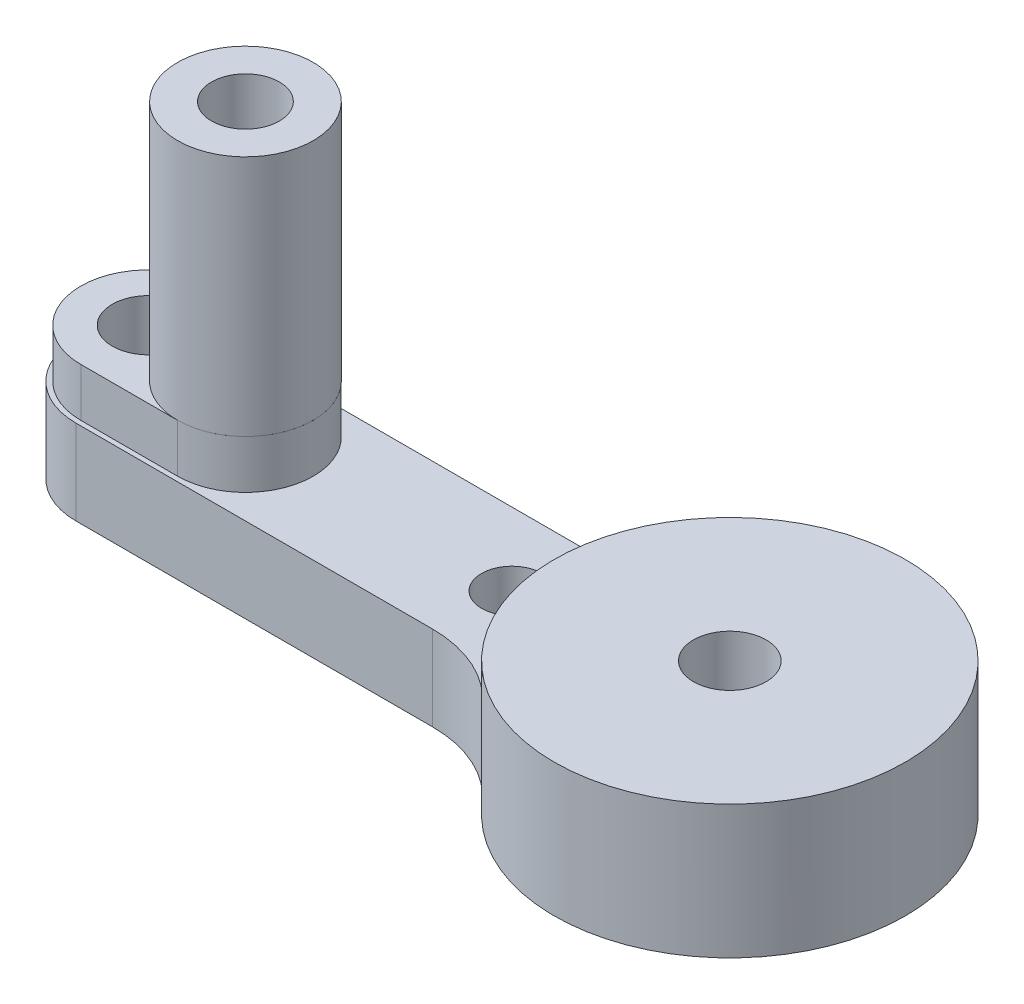
ISO-10303-21;
HEADER;
FILE_DESCRIPTION(('STEP AP214'),'2;1');
FILE_NAME('part.step','',(''),(''),'','','');
FILE_SCHEMA(('AUTOMOTIVE_DESIGN { 1 0 10303 214 1 1 1 1 }'));
ENDSEC;
DATA;
#1=APPLICATION_CONTEXT('core data for automotive mechanical design processes');
#2=APPLICATION_PROTOCOL_DEFINITION('international standard','automotive_design',2000,#1);
#3=PRODUCT_CONTEXT('',#1,'mechanical');
#4=PRODUCT('Part','Part','',(#3));
#5=PRODUCT_RELATED_PRODUCT_CATEGORY('part','',(#4));
#6=PRODUCT_DEFINITION_FORMATION('','',#4);
#7=PRODUCT_DEFINITION_CONTEXT('part definition',#1,'design');
#8=PRODUCT_DEFINITION('design','',#6,#7);
#9=PRODUCT_DEFINITION_SHAPE('','',#8);
#10=(LENGTH_UNIT() NAMED_UNIT(*) SI_UNIT(.MILLI.,.METRE.));
#11=(NAMED_UNIT(*) PLANE_ANGLE_UNIT() SI_UNIT($,.RADIAN.));
#12=(NAMED_UNIT(*) SI_UNIT($,.STERADIAN.) SOLID_ANGLE_UNIT());
#13=UNCERTAINTY_MEASURE_WITH_UNIT(LENGTH_MEASURE(1.E-05),#10,'distance_accuracy_value','');
#14=(GEOMETRIC_REPRESENTATION_CONTEXT(3) GLOBAL_UNCERTAINTY_ASSIGNED_CONTEXT((#13)) GLOBAL_UNIT_ASSIGNED_CONTEXT((#10,
#11,#12)) REPRESENTATION_CONTEXT('',''));
#15=CARTESIAN_POINT('',(0.,0.,0.));
#16=DIRECTION('',(0.,0.,1.));
#17=DIRECTION('',(1.,0.,0.));
#18=AXIS2_PLACEMENT_3D('',#15,#16,#17);
#19=CARTESIAN_POINT('',(-20.,15.5,0.));
#20=DIRECTION('',(0.,1.,0.));
#21=DIRECTION('',(0.,0.,1.));
#22=AXIS2_PLACEMENT_3D('',#19,#20,#21);
#23=PLANE('',#22);
#24=CARTESIAN_POINT('',(-20.,15.5,0.));
#25=DIRECTION('',(0.,1.,0.));
#26=DIRECTION('',(0.,0.,1.));
#27=AXIS2_PLACEMENT_3D('',#24,#25,#26);
#28=CIRCLE('',#27,2.8);
#29=CARTESIAN_POINT('',(-20.,15.5,2.8));
#30=VERTEX_POINT('',#29);
#31=EDGE_CURVE('E11',#30,#30,#28,.T.);
#32=ORIENTED_EDGE('',*,*,#31,.T.);
#33=EDGE_LOOP('',(#32));
#34=FACE_BOUND('',#33,.T.);
#35=CARTESIAN_POINT('',(-20.,15.5,0.));
#36=DIRECTION('',(0.,1.,0.));
#37=DIRECTION('',(0.,0.,1.));
#38=AXIS2_PLACEMENT_3D('',#35,#36,#37);
#39=CIRCLE('',#38,1.4);
#40=CARTESIAN_POINT('',(-20.,15.5,1.4));
#41=VERTEX_POINT('',#40);
#42=EDGE_CURVE('E59',#41,#41,#39,.T.);
#43=ORIENTED_EDGE('',*,*,#42,.F.);
#44=EDGE_LOOP('',(#43));
#45=FACE_BOUND('',#44,.T.);
#46=ADVANCED_FACE('F50',(#34,#45),#23,.T.);
#47=CARTESIAN_POINT('',(-20.,5.5,0.));
#48=DIRECTION('',(0.,1.,0.));
#49=DIRECTION('',(0.,0.,1.));
#50=AXIS2_PLACEMENT_3D('',#47,#48,#49);
#51=PLANE('',#50);
#52=CARTESIAN_POINT('',(-20.,5.5,0.));
#53=DIRECTION('',(0.,1.,0.));
#54=DIRECTION('',(0.,0.,1.));
#55=AXIS2_PLACEMENT_3D('',#52,#53,#54);
#56=CIRCLE('',#55,2.8);
#57=CARTESIAN_POINT('',(-20.,5.5,2.8));
#58=VERTEX_POINT('',#57);
#59=EDGE_CURVE('E51',#58,#58,#56,.T.);
#60=ORIENTED_EDGE('',*,*,#59,.F.);
#61=EDGE_LOOP('',(#60));
#62=FACE_BOUND('',#61,.T.);
#63=CARTESIAN_POINT('',(-20.,5.5,0.));
#64=DIRECTION('',(0.,1.,0.));
#65=DIRECTION('',(0.,0.,1.));
#66=AXIS2_PLACEMENT_3D('',#63,#64,#65);
#67=CIRCLE('',#66,1.4);
#68=CARTESIAN_POINT('',(-20.,5.5,1.4));
#69=VERTEX_POINT('',#68);
#70=EDGE_CURVE('E58',#69,#69,#67,.T.);
#71=ORIENTED_EDGE('',*,*,#70,.T.);
#72=EDGE_LOOP('',(#71));
#73=FACE_BOUND('',#72,.T.);
#74=ADVANCED_FACE('F69',(#62,#73),#51,.F.);
#75=CARTESIAN_POINT('',(-20.,15.5,0.));
#76=DIRECTION('',(0.,-1.,0.));
#77=DIRECTION('',(0.,0.,-1.));
#78=AXIS2_PLACEMENT_3D('',#75,#76,#77);
#79=CYLINDRICAL_SURFACE('',#78,2.8);
#80=ORIENTED_EDGE('',*,*,#31,.F.);
#81=EDGE_LOOP('',(#80));
#82=FACE_BOUND('',#81,.T.);
#83=ORIENTED_EDGE('',*,*,#59,.T.);
#84=EDGE_LOOP('',(#83));
#85=FACE_BOUND('',#84,.T.);
#86=ADVANCED_FACE('F47',(#82,#85),#79,.T.);
#87=CARTESIAN_POINT('',(-20.,15.5,0.));
#88=DIRECTION('',(0.,-1.,0.));
#89=DIRECTION('',(0.,0.,-1.));
#90=AXIS2_PLACEMENT_3D('',#87,#88,#89);
#91=CYLINDRICAL_SURFACE('',#90,1.4);
#92=ORIENTED_EDGE('',*,*,#42,.T.);
#93=EDGE_LOOP('',(#92));
#94=FACE_BOUND('',#93,.T.);
#95=ORIENTED_EDGE('',*,*,#70,.F.);
#96=EDGE_LOOP('',(#95));
#97=FACE_BOUND('',#96,.T.);
#98=ADVANCED_FACE('F66',(#94,#97),#91,.F.);
#99=CLOSED_SHELL('',(#46,#74,#86,#98));
#100=MANIFOLD_SOLID_BREP('B2',#99);
#101=CARTESIAN_POINT('',(-9.27698765763974,3.5,8.));
#102=DIRECTION('',(0.,-1.,0.));
#103=DIRECTION('',(0.,0.,-1.));
#104=AXIS2_PLACEMENT_3D('',#101,#102,#103);
#105=PLANE('',#104);
#106=CARTESIAN_POINT('',(0.,3.5,0.));
#107=DIRECTION('',(0.,1.,0.));
#108=DIRECTION('',(0.,0.,1.));
#109=AXIS2_PLACEMENT_3D('',#106,#107,#108);
#110=CIRCLE('',#109,7.25);
#111=CARTESIAN_POINT('',(-5.4904620830929,3.5,-4.73469387755102));
#112=VERTEX_POINT('',#111);
#113=CARTESIAN_POINT('',(-5.4904620830929,3.5,4.73469387755102));
#114=VERTEX_POINT('',#113);
#115=EDGE_CURVE('E201',#112,#114,#110,.T.);
#116=ORIENTED_EDGE('',*,*,#115,.F.);
#117=CARTESIAN_POINT('',(-9.27698765763974,3.5,-8.));
#118=DIRECTION('',(0.,-1.,0.));
#119=DIRECTION('',(0.,0.,1.));
#120=AXIS2_PLACEMENT_3D('',#117,#118,#119);
#121=CIRCLE('',#120,5.);
#122=CARTESIAN_POINT('',(-9.27698765763973,3.5,-3.));
#123=VERTEX_POINT('',#122);
#124=EDGE_CURVE('E235',#112,#123,#121,.T.);
#125=ORIENTED_EDGE('',*,*,#124,.T.);
#126=DIRECTION('',(-1.,0.,0.));
#127=VECTOR('',#126,1.);
#128=CARTESIAN_POINT('',(-24.,3.5,-3.));
#129=LINE('',#128,#127);
#130=CARTESIAN_POINT('',(-24.,3.5,-3.));
#131=VERTEX_POINT('',#130);
#132=EDGE_CURVE('E234',#123,#131,#129,.T.);
#133=ORIENTED_EDGE('',*,*,#132,.T.);
#134=CARTESIAN_POINT('',(-24.,3.5,0.));
#135=DIRECTION('',(0.,1.,0.));
#136=DIRECTION('',(0.,0.,1.));
#137=AXIS2_PLACEMENT_3D('',#134,#135,#136);
#138=CIRCLE('',#137,3.);
#139=CARTESIAN_POINT('',(-24.,3.5,3.));
#140=VERTEX_POINT('',#139);
#141=EDGE_CURVE('E240',#131,#140,#138,.T.);
#142=ORIENTED_EDGE('',*,*,#141,.T.);
#143=DIRECTION('',(1.,0.,0.));
#144=VECTOR('',#143,1.);
#145=CARTESIAN_POINT('',(-24.,3.5,3.));
#146=LINE('',#145,#144);
#147=CARTESIAN_POINT('',(-9.27698765763974,3.5,3.));
#148=VERTEX_POINT('',#147);
#149=EDGE_CURVE('E239',#140,#148,#146,.T.);
#150=ORIENTED_EDGE('',*,*,#149,.T.);
#151=CARTESIAN_POINT('',(-9.27698765763974,3.5,8.));
#152=DIRECTION('',(0.,-1.,0.));
#153=DIRECTION('',(0.,0.,-1.));
#154=AXIS2_PLACEMENT_3D('',#151,#152,#153);
#155=CIRCLE('',#154,5.);
#156=EDGE_CURVE('E227',#148,#114,#155,.T.);
#157=ORIENTED_EDGE('',*,*,#156,.T.);
#158=EDGE_LOOP('',(#116,#125,#133,#142,#150,#157));
#159=FACE_BOUND('',#158,.T.);
#160=CARTESIAN_POINT('',(-9.,3.5,0.));
#161=DIRECTION('',(0.,1.,0.));
#162=DIRECTION('',(0.,0.,1.));
#163=AXIS2_PLACEMENT_3D('',#160,#161,#162);
#164=CIRCLE('',#163,1.25);
#165=CARTESIAN_POINT('',(-9.,3.5,1.25));
#166=VERTEX_POINT('',#165);
#167=EDGE_CURVE('E214',#166,#166,#164,.T.);
#168=ORIENTED_EDGE('',*,*,#167,.F.);
#169=EDGE_LOOP('',(#168));
#170=FACE_BOUND('',#169,.T.);
#171=CARTESIAN_POINT('',(-20.,3.5,0.));
#172=DIRECTION('',(0.,1.,0.));
#173=DIRECTION('',(0.,0.,1.));
#174=AXIS2_PLACEMENT_3D('',#171,#172,#173);
#175=CIRCLE('',#174,2.8);
#176=CARTESIAN_POINT('',(-20.,3.5,2.8));
#177=VERTEX_POINT('',#176);
#178=CARTESIAN_POINT('',(-20.,3.5,-2.8));
#179=VERTEX_POINT('',#178);
#180=EDGE_CURVE('E200',#177,#179,#175,.T.);
#181=ORIENTED_EDGE('',*,*,#180,.F.);
#182=DIRECTION('',(1.,0.,0.));
#183=VECTOR('',#182,1.);
#184=CARTESIAN_POINT('',(-20.,3.5,2.8));
#185=LINE('',#184,#183);
#186=CARTESIAN_POINT('',(-24.,3.5,2.8));
#187=VERTEX_POINT('',#186);
#188=EDGE_CURVE('E198',#187,#177,#185,.T.);
#189=ORIENTED_EDGE('',*,*,#188,.F.);
#190=CARTESIAN_POINT('',(-24.,3.5,0.));
#191=DIRECTION('',(0.,1.,0.));
#192=DIRECTION('',(0.,0.,1.));
#193=AXIS2_PLACEMENT_3D('',#190,#191,#192);
#194=CIRCLE('',#193,2.8);
#195=CARTESIAN_POINT('',(-24.,3.5,-2.8));
#196=VERTEX_POINT('',#195);
#197=EDGE_CURVE('E121',#196,#187,#194,.T.);
#198=ORIENTED_EDGE('',*,*,#197,.F.);
#199=DIRECTION('',(-1.,0.,0.));
#200=VECTOR('',#199,1.);
#201=CARTESIAN_POINT('',(-24.,3.5,-2.8));
#202=LINE('',#201,#200);
#203=EDGE_CURVE('E118',#179,#196,#202,.T.);
#204=ORIENTED_EDGE('',*,*,#203,.F.);
#205=EDGE_LOOP('',(#181,#189,#198,#204));
#206=FACE_BOUND('',#205,.T.);
#207=ADVANCED_FACE('F101',(#159,#170,#206),#105,.F.);
#208=CARTESIAN_POINT('',(-9.27698765763974,0.,8.));
#209=DIRECTION('',(0.,-1.,0.));
#210=DIRECTION('',(0.,0.,-1.));
#211=AXIS2_PLACEMENT_3D('',#208,#209,#210);
#212=PLANE('',#211);
#213=CARTESIAN_POINT('',(-20.,0.,0.));
#214=DIRECTION('',(0.,1.,0.));
#215=DIRECTION('',(0.,0.,1.));
#216=AXIS2_PLACEMENT_3D('',#213,#214,#215);
#217=CIRCLE('',#216,1.5);
#218=CARTESIAN_POINT('',(-20.,0.,1.5));
#219=VERTEX_POINT('',#218);
#220=EDGE_CURVE('E217',#219,#219,#217,.T.);
#221=ORIENTED_EDGE('',*,*,#220,.T.);
#222=EDGE_LOOP('',(#221));
#223=FACE_BOUND('',#222,.T.);
#224=CARTESIAN_POINT('',(0.,0.,0.));
#225=DIRECTION('',(0.,1.,0.));
#226=DIRECTION('',(0.,0.,1.));
#227=AXIS2_PLACEMENT_3D('',#224,#225,#226);
#228=CIRCLE('',#227,1.5);
#229=CARTESIAN_POINT('',(0.,0.,1.5));
#230=VERTEX_POINT('',#229);
#231=EDGE_CURVE('E228',#230,#230,#228,.T.);
#232=ORIENTED_EDGE('',*,*,#231,.T.);
#233=EDGE_LOOP('',(#232));
#234=FACE_BOUND('',#233,.T.);
#235=CARTESIAN_POINT('',(-9.27698765763974,0.,8.));
#236=DIRECTION('',(0.,-1.,0.));
#237=DIRECTION('',(0.,0.,-1.));
#238=AXIS2_PLACEMENT_3D('',#235,#236,#237);
#239=CIRCLE('',#238,5.);
#240=CARTESIAN_POINT('',(-9.27698765763974,0.,3.));
#241=VERTEX_POINT('',#240);
#242=CARTESIAN_POINT('',(-5.4904620830929,0.,4.73469387755102));
#243=VERTEX_POINT('',#242);
#244=EDGE_CURVE('E229',#241,#243,#239,.T.);
#245=ORIENTED_EDGE('',*,*,#244,.F.);
#246=DIRECTION('',(1.,0.,0.));
#247=VECTOR('',#246,1.);
#248=CARTESIAN_POINT('',(-24.,0.,3.));
#249=LINE('',#248,#247);
#250=CARTESIAN_POINT('',(-24.,0.,3.));
#251=VERTEX_POINT('',#250);
#252=EDGE_CURVE('E233',#251,#241,#249,.T.);
#253=ORIENTED_EDGE('',*,*,#252,.F.);
#254=CARTESIAN_POINT('',(-24.,0.,0.));
#255=DIRECTION('',(0.,1.,0.));
#256=DIRECTION('',(0.,0.,1.));
#257=AXIS2_PLACEMENT_3D('',#254,#255,#256);
#258=CIRCLE('',#257,3.);
#259=CARTESIAN_POINT('',(-24.,0.,-3.));
#260=VERTEX_POINT('',#259);
#261=EDGE_CURVE('E249',#260,#251,#258,.T.);
#262=ORIENTED_EDGE('',*,*,#261,.F.);
#263=DIRECTION('',(-1.,0.,0.));
#264=VECTOR('',#263,1.);
#265=CARTESIAN_POINT('',(-24.,0.,-3.));
#266=LINE('',#265,#264);
#267=CARTESIAN_POINT('',(-9.27698765763973,0.,-3.));
#268=VERTEX_POINT('',#267);
#269=EDGE_CURVE('E248',#268,#260,#266,.T.);
#270=ORIENTED_EDGE('',*,*,#269,.F.);
#271=CARTESIAN_POINT('',(-9.27698765763974,0.,-8.));
#272=DIRECTION('',(0.,-1.,0.));
#273=DIRECTION('',(0.,0.,1.));
#274=AXIS2_PLACEMENT_3D('',#271,#272,#273);
#275=CIRCLE('',#274,5.);
#276=CARTESIAN_POINT('',(-5.49046208309291,0.,-4.73469387755102));
#277=VERTEX_POINT('',#276);
#278=EDGE_CURVE('E246',#277,#268,#275,.T.);
#279=ORIENTED_EDGE('',*,*,#278,.F.);
#280=CARTESIAN_POINT('',(0.,0.,0.));
#281=DIRECTION('',(0.,1.,0.));
#282=DIRECTION('',(0.,0.,1.));
#283=AXIS2_PLACEMENT_3D('',#280,#281,#282);
#284=CIRCLE('',#283,7.25);
#285=EDGE_CURVE('E244',#243,#277,#284,.T.);
#286=ORIENTED_EDGE('',*,*,#285,.F.);
#287=EDGE_LOOP('',(#245,#253,#262,#270,#279,#286));
#288=FACE_BOUND('',#287,.T.);
#289=CARTESIAN_POINT('',(-24.,0.,0.));
#290=DIRECTION('',(0.,1.,0.));
#291=DIRECTION('',(0.,0.,1.));
#292=AXIS2_PLACEMENT_3D('',#289,#290,#291);
#293=CIRCLE('',#292,1.5);
#294=CARTESIAN_POINT('',(-24.,0.,1.5));
#295=VERTEX_POINT('',#294);
#296=EDGE_CURVE('E224',#295,#295,#293,.T.);
#297=ORIENTED_EDGE('',*,*,#296,.T.);
#298=EDGE_LOOP('',(#297));
#299=FACE_BOUND('',#298,.T.);
#300=CARTESIAN_POINT('',(-9.,0.,0.));
#301=DIRECTION('',(0.,1.,0.));
#302=DIRECTION('',(0.,0.,1.));
#303=AXIS2_PLACEMENT_3D('',#300,#301,#302);
#304=CIRCLE('',#303,1.25);
#305=CARTESIAN_POINT('',(-9.,0.,1.25));
#306=VERTEX_POINT('',#305);
#307=EDGE_CURVE('E215',#306,#306,#304,.T.);
#308=ORIENTED_EDGE('',*,*,#307,.T.);
#309=EDGE_LOOP('',(#308));
#310=FACE_BOUND('',#309,.T.);
#311=ADVANCED_FACE('F273',(#223,#234,#288,#299,#310),#212,.T.);
#312=CARTESIAN_POINT('',(-9.27698765763974,3.5,8.));
#313=DIRECTION('',(0.,-1.,0.));
#314=DIRECTION('',(0.,0.,-1.));
#315=AXIS2_PLACEMENT_3D('',#312,#313,#314);
#316=CYLINDRICAL_SURFACE('',#315,5.);
#317=ORIENTED_EDGE('',*,*,#244,.T.);
#318=DIRECTION('',(0.,-1.,0.));
#319=VECTOR('',#318,1.);
#320=CARTESIAN_POINT('',(-5.4904620830929,3.5,4.73469387755102));
#321=LINE('',#320,#319);
#322=EDGE_CURVE('E44',#114,#243,#321,.T.);
#323=ORIENTED_EDGE('',*,*,#322,.F.);
#324=ORIENTED_EDGE('',*,*,#156,.F.);
#325=DIRECTION('',(0.,-1.,0.));
#326=VECTOR('',#325,1.);
#327=CARTESIAN_POINT('',(-9.27698765763974,3.5,3.));
#328=LINE('',#327,#326);
#329=EDGE_CURVE('E243',#148,#241,#328,.T.);
#330=ORIENTED_EDGE('',*,*,#329,.T.);
#331=EDGE_LOOP('',(#317,#323,#324,#330));
#332=FACE_BOUND('',#331,.T.);
#333=ADVANCED_FACE('F103',(#332),#316,.F.);
#334=CARTESIAN_POINT('',(0.,3.5,0.));
#335=DIRECTION('',(0.,-1.,0.));
#336=DIRECTION('',(0.,0.,-1.));
#337=AXIS2_PLACEMENT_3D('',#334,#335,#336);
#338=CYLINDRICAL_SURFACE('',#337,7.25);
#339=ORIENTED_EDGE('',*,*,#285,.T.);
#340=DIRECTION('',(0.,-1.,0.));
#341=VECTOR('',#340,1.);
#342=CARTESIAN_POINT('',(-5.49046208309291,3.5,-4.73469387755102));
#343=LINE('',#342,#341);
#344=EDGE_CURVE('E108',#112,#277,#343,.T.);
#345=ORIENTED_EDGE('',*,*,#344,.F.);
#346=ORIENTED_EDGE('',*,*,#115,.T.);
#347=ORIENTED_EDGE('',*,*,#322,.T.);
#348=EDGE_LOOP('',(#339,#345,#346,#347));
#349=FACE_BOUND('',#348,.T.);
#350=CARTESIAN_POINT('',(0.,5.5,0.));
#351=DIRECTION('',(0.,1.,0.));
#352=DIRECTION('',(0.,0.,1.));
#353=AXIS2_PLACEMENT_3D('',#350,#351,#352);
#354=CIRCLE('',#353,7.25);
#355=CARTESIAN_POINT('',(0.,5.5,7.25));
#356=VERTEX_POINT('',#355);
#357=EDGE_CURVE('E207',#356,#356,#354,.T.);
#358=ORIENTED_EDGE('',*,*,#357,.F.);
#359=EDGE_LOOP('',(#358));
#360=FACE_BOUND('',#359,.T.);
#361=ADVANCED_FACE('F295',(#349,#360),#338,.T.);
#362=CARTESIAN_POINT('',(-9.27698765763974,3.5,-8.));
#363=DIRECTION('',(0.,-1.,0.));
#364=DIRECTION('',(0.,0.,-1.));
#365=AXIS2_PLACEMENT_3D('',#362,#363,#364);
#366=CYLINDRICAL_SURFACE('',#365,5.);
#367=ORIENTED_EDGE('',*,*,#278,.T.);
#368=DIRECTION('',(0.,-1.,0.));
#369=VECTOR('',#368,1.);
#370=CARTESIAN_POINT('',(-9.27698765763973,3.5,-3.));
#371=LINE('',#370,#369);
#372=EDGE_CURVE('E261',#123,#268,#371,.T.);
#373=ORIENTED_EDGE('',*,*,#372,.F.);
#374=ORIENTED_EDGE('',*,*,#124,.F.);
#375=ORIENTED_EDGE('',*,*,#344,.T.);
#376=EDGE_LOOP('',(#367,#373,#374,#375));
#377=FACE_BOUND('',#376,.T.);
#378=ADVANCED_FACE('F270',(#377),#366,.F.);
#379=CARTESIAN_POINT('',(-24.,3.5,-3.));
#380=DIRECTION('',(0.,0.,1.));
#381=DIRECTION('',(1.,0.,0.));
#382=AXIS2_PLACEMENT_3D('',#379,#380,#381);
#383=PLANE('',#382);
#384=ORIENTED_EDGE('',*,*,#269,.T.);
#385=DIRECTION('',(0.,-1.,0.));
#386=VECTOR('',#385,1.);
#387=CARTESIAN_POINT('',(-24.,3.5,-3.));
#388=LINE('',#387,#386);
#389=EDGE_CURVE('E256',#131,#260,#388,.T.);
#390=ORIENTED_EDGE('',*,*,#389,.F.);
#391=ORIENTED_EDGE('',*,*,#132,.F.);
#392=ORIENTED_EDGE('',*,*,#372,.T.);
#393=EDGE_LOOP('',(#384,#390,#391,#392));
#394=FACE_BOUND('',#393,.T.);
#395=ADVANCED_FACE('F278',(#394),#383,.F.);
#396=CARTESIAN_POINT('',(-24.,3.5,0.));
#397=DIRECTION('',(0.,-1.,0.));
#398=DIRECTION('',(0.,0.,-1.));
#399=AXIS2_PLACEMENT_3D('',#396,#397,#398);
#400=CYLINDRICAL_SURFACE('',#399,3.);
#401=ORIENTED_EDGE('',*,*,#261,.T.);
#402=DIRECTION('',(0.,-1.,0.));
#403=VECTOR('',#402,1.);
#404=CARTESIAN_POINT('',(-24.,3.5,3.));
#405=LINE('',#404,#403);
#406=EDGE_CURVE('E254',#140,#251,#405,.T.);
#407=ORIENTED_EDGE('',*,*,#406,.F.);
#408=ORIENTED_EDGE('',*,*,#141,.F.);
#409=ORIENTED_EDGE('',*,*,#389,.T.);
#410=EDGE_LOOP('',(#401,#407,#408,#409));
#411=FACE_BOUND('',#410,.T.);
#412=ADVANCED_FACE('F284',(#411),#400,.T.);
#413=CARTESIAN_POINT('',(-24.,3.5,3.));
#414=DIRECTION('',(0.,0.,-1.));
#415=DIRECTION('',(-1.,0.,0.));
#416=AXIS2_PLACEMENT_3D('',#413,#414,#415);
#417=PLANE('',#416);
#418=ORIENTED_EDGE('',*,*,#252,.T.);
#419=ORIENTED_EDGE('',*,*,#329,.F.);
#420=ORIENTED_EDGE('',*,*,#149,.F.);
#421=ORIENTED_EDGE('',*,*,#406,.T.);
#422=EDGE_LOOP('',(#418,#419,#420,#421));
#423=FACE_BOUND('',#422,.T.);
#424=ADVANCED_FACE('F298',(#423),#417,.F.);
#425=CARTESIAN_POINT('',(0.,3.5,0.));
#426=DIRECTION('',(0.,-1.,0.));
#427=DIRECTION('',(0.,0.,-1.));
#428=AXIS2_PLACEMENT_3D('',#425,#426,#427);
#429=CYLINDRICAL_SURFACE('',#428,1.5);
#430=ORIENTED_EDGE('',*,*,#231,.F.);
#431=EDGE_LOOP('',(#430));
#432=FACE_BOUND('',#431,.T.);
#433=CARTESIAN_POINT('',(0.,5.5,0.));
#434=DIRECTION('',(0.,1.,0.));
#435=DIRECTION('',(0.,0.,1.));
#436=AXIS2_PLACEMENT_3D('',#433,#434,#435);
#437=CIRCLE('',#436,1.5);
#438=CARTESIAN_POINT('',(0.,5.5,1.5));
#439=VERTEX_POINT('',#438);
#440=EDGE_CURVE('E199',#439,#439,#437,.T.);
#441=ORIENTED_EDGE('',*,*,#440,.T.);
#442=EDGE_LOOP('',(#441));
#443=FACE_BOUND('',#442,.T.);
#444=ADVANCED_FACE('F296',(#432,#443),#429,.F.);
#445=CARTESIAN_POINT('',(-24.,3.5,0.));
#446=DIRECTION('',(0.,-1.,0.));
#447=DIRECTION('',(0.,0.,-1.));
#448=AXIS2_PLACEMENT_3D('',#445,#446,#447);
#449=CYLINDRICAL_SURFACE('',#448,1.5);
#450=ORIENTED_EDGE('',*,*,#296,.F.);
#451=EDGE_LOOP('',(#450));
#452=FACE_BOUND('',#451,.T.);
#453=CARTESIAN_POINT('',(-24.,5.5,0.));
#454=DIRECTION('',(0.,1.,0.));
#455=DIRECTION('',(0.,0.,1.));
#456=AXIS2_PLACEMENT_3D('',#453,#454,#455);
#457=CIRCLE('',#456,1.5);
#458=CARTESIAN_POINT('',(-24.,5.5,1.5));
#459=VERTEX_POINT('',#458);
#460=EDGE_CURVE('E355',#459,#459,#457,.T.);
#461=ORIENTED_EDGE('',*,*,#460,.T.);
#462=EDGE_LOOP('',(#461));
#463=FACE_BOUND('',#462,.T.);
#464=ADVANCED_FACE('F304',(#452,#463),#449,.F.);
#465=CARTESIAN_POINT('',(-20.,3.5,0.));
#466=DIRECTION('',(0.,-1.,0.));
#467=DIRECTION('',(0.,0.,-1.));
#468=AXIS2_PLACEMENT_3D('',#465,#466,#467);
#469=CYLINDRICAL_SURFACE('',#468,1.5);
#470=ORIENTED_EDGE('',*,*,#220,.F.);
#471=EDGE_LOOP('',(#470));
#472=FACE_BOUND('',#471,.T.);
#473=CARTESIAN_POINT('',(-20.,5.5,0.));
#474=DIRECTION('',(0.,1.,0.));
#475=DIRECTION('',(0.,0.,1.));
#476=AXIS2_PLACEMENT_3D('',#473,#474,#475);
#477=CIRCLE('',#476,1.5);
#478=CARTESIAN_POINT('',(-20.,5.5,1.5));
#479=VERTEX_POINT('',#478);
#480=EDGE_CURVE('E348',#479,#479,#477,.T.);
#481=ORIENTED_EDGE('',*,*,#480,.T.);
#482=EDGE_LOOP('',(#481));
#483=FACE_BOUND('',#482,.T.);
#484=ADVANCED_FACE('F319',(#472,#483),#469,.F.);
#485=CARTESIAN_POINT('',(-9.,3.5,0.));
#486=DIRECTION('',(0.,-1.,0.));
#487=DIRECTION('',(0.,0.,-1.));
#488=AXIS2_PLACEMENT_3D('',#485,#486,#487);
#489=CYLINDRICAL_SURFACE('',#488,1.25);
#490=ORIENTED_EDGE('',*,*,#167,.T.);
#491=EDGE_LOOP('',(#490));
#492=FACE_BOUND('',#491,.T.);
#493=ORIENTED_EDGE('',*,*,#307,.F.);
#494=EDGE_LOOP('',(#493));
#495=FACE_BOUND('',#494,.T.);
#496=ADVANCED_FACE('F322',(#492,#495),#489,.F.);
#497=CARTESIAN_POINT('',(0.,5.5,0.));
#498=DIRECTION('',(0.,1.,0.));
#499=DIRECTION('',(0.,0.,1.));
#500=AXIS2_PLACEMENT_3D('',#497,#498,#499);
#501=PLANE('',#500);
#502=ORIENTED_EDGE('',*,*,#357,.T.);
#503=EDGE_LOOP('',(#502));
#504=FACE_BOUND('',#503,.T.);
#505=ORIENTED_EDGE('',*,*,#440,.F.);
#506=EDGE_LOOP('',(#505));
#507=FACE_BOUND('',#506,.T.);
#508=ADVANCED_FACE('F330',(#504,#507),#501,.T.);
#509=CARTESIAN_POINT('',(-20.,5.5,0.));
#510=DIRECTION('',(0.,1.,0.));
#511=DIRECTION('',(0.,0.,1.));
#512=AXIS2_PLACEMENT_3D('',#509,#510,#511);
#513=PLANE('',#512);
#514=ORIENTED_EDGE('',*,*,#480,.F.);
#515=EDGE_LOOP('',(#514));
#516=FACE_BOUND('',#515,.T.);
#517=CARTESIAN_POINT('',(-20.,5.5,0.));
#518=DIRECTION('',(0.,1.,0.));
#519=DIRECTION('',(0.,0.,1.));
#520=AXIS2_PLACEMENT_3D('',#517,#518,#519);
#521=CIRCLE('',#520,2.8);
#522=CARTESIAN_POINT('',(-20.,5.5,2.8));
#523=VERTEX_POINT('',#522);
#524=CARTESIAN_POINT('',(-20.,5.5,-2.8));
#525=VERTEX_POINT('',#524);
#526=EDGE_CURVE('E188',#523,#525,#521,.T.);
#527=ORIENTED_EDGE('',*,*,#526,.T.);
#528=DIRECTION('',(-1.,0.,0.));
#529=VECTOR('',#528,1.);
#530=CARTESIAN_POINT('',(-24.,5.5,-2.8));
#531=LINE('',#530,#529);
#532=CARTESIAN_POINT('',(-24.,5.5,-2.8));
#533=VERTEX_POINT('',#532);
#534=EDGE_CURVE('E172',#525,#533,#531,.T.);
#535=ORIENTED_EDGE('',*,*,#534,.T.);
#536=CARTESIAN_POINT('',(-24.,5.5,0.));
#537=DIRECTION('',(0.,1.,0.));
#538=DIRECTION('',(0.,0.,1.));
#539=AXIS2_PLACEMENT_3D('',#536,#537,#538);
#540=CIRCLE('',#539,2.8);
#541=CARTESIAN_POINT('',(-24.,5.5,2.8));
#542=VERTEX_POINT('',#541);
#543=EDGE_CURVE('E183',#533,#542,#540,.T.);
#544=ORIENTED_EDGE('',*,*,#543,.T.);
#545=DIRECTION('',(1.,0.,0.));
#546=VECTOR('',#545,1.);
#547=CARTESIAN_POINT('',(-20.,5.5,2.8));
#548=LINE('',#547,#546);
#549=EDGE_CURVE('E195',#542,#523,#548,.T.);
#550=ORIENTED_EDGE('',*,*,#549,.T.);
#551=EDGE_LOOP('',(#527,#535,#544,#550));
#552=FACE_BOUND('',#551,.T.);
#553=ORIENTED_EDGE('',*,*,#460,.F.);
#554=EDGE_LOOP('',(#553));
#555=FACE_BOUND('',#554,.T.);
#556=ADVANCED_FACE('F189',(#516,#552,#555),#513,.T.);
#557=CARTESIAN_POINT('',(-20.,5.5,0.));
#558=DIRECTION('',(0.,-1.,0.));
#559=DIRECTION('',(0.,0.,-1.));
#560=AXIS2_PLACEMENT_3D('',#557,#558,#559);
#561=CYLINDRICAL_SURFACE('',#560,2.8);
#562=ORIENTED_EDGE('',*,*,#180,.T.);
#563=DIRECTION('',(0.,-1.,0.));
#564=VECTOR('',#563,1.);
#565=CARTESIAN_POINT('',(-20.,5.5,-2.8));
#566=LINE('',#565,#564);
#567=EDGE_CURVE('E177',#525,#179,#566,.T.);
#568=ORIENTED_EDGE('',*,*,#567,.F.);
#569=ORIENTED_EDGE('',*,*,#526,.F.);
#570=DIRECTION('',(0.,-1.,0.));
#571=VECTOR('',#570,1.);
#572=CARTESIAN_POINT('',(-20.,5.5,2.8));
#573=LINE('',#572,#571);
#574=EDGE_CURVE('E357',#523,#177,#573,.T.);
#575=ORIENTED_EDGE('',*,*,#574,.T.);
#576=EDGE_LOOP('',(#562,#568,#569,#575));
#577=FACE_BOUND('',#576,.T.);
#578=ADVANCED_FACE('F196',(#577),#561,.T.);
#579=CARTESIAN_POINT('',(-24.,5.5,-2.8));
#580=DIRECTION('',(0.,0.,1.));
#581=DIRECTION('',(1.,0.,0.));
#582=AXIS2_PLACEMENT_3D('',#579,#580,#581);
#583=PLANE('',#582);
#584=ORIENTED_EDGE('',*,*,#203,.T.);
#585=DIRECTION('',(0.,-1.,0.));
#586=VECTOR('',#585,1.);
#587=CARTESIAN_POINT('',(-24.,5.5,-2.8));
#588=LINE('',#587,#586);
#589=EDGE_CURVE('E185',#533,#196,#588,.T.);
#590=ORIENTED_EDGE('',*,*,#589,.F.);
#591=ORIENTED_EDGE('',*,*,#534,.F.);
#592=ORIENTED_EDGE('',*,*,#567,.T.);
#593=EDGE_LOOP('',(#584,#590,#591,#592));
#594=FACE_BOUND('',#593,.T.);
#595=ADVANCED_FACE('F180',(#594),#583,.F.);
#596=CARTESIAN_POINT('',(-24.,5.5,0.));
#597=DIRECTION('',(0.,-1.,0.));
#598=DIRECTION('',(0.,0.,-1.));
#599=AXIS2_PLACEMENT_3D('',#596,#597,#598);
#600=CYLINDRICAL_SURFACE('',#599,2.8);
#601=ORIENTED_EDGE('',*,*,#197,.T.);
#602=DIRECTION('',(0.,-1.,0.));
#603=VECTOR('',#602,1.);
#604=CARTESIAN_POINT('',(-24.,5.5,2.8));
#605=LINE('',#604,#603);
#606=EDGE_CURVE('E202',#542,#187,#605,.T.);
#607=ORIENTED_EDGE('',*,*,#606,.F.);
#608=ORIENTED_EDGE('',*,*,#543,.F.);
#609=ORIENTED_EDGE('',*,*,#589,.T.);
#610=EDGE_LOOP('',(#601,#607,#608,#609));
#611=FACE_BOUND('',#610,.T.);
#612=ADVANCED_FACE('F338',(#611),#600,.T.);
#613=CARTESIAN_POINT('',(-20.,5.5,2.8));
#614=DIRECTION('',(0.,0.,-1.));
#615=DIRECTION('',(-1.,0.,0.));
#616=AXIS2_PLACEMENT_3D('',#613,#614,#615);
#617=PLANE('',#616);
#618=ORIENTED_EDGE('',*,*,#188,.T.);
#619=ORIENTED_EDGE('',*,*,#574,.F.);
#620=ORIENTED_EDGE('',*,*,#549,.F.);
#621=ORIENTED_EDGE('',*,*,#606,.T.);
#622=EDGE_LOOP('',(#618,#619,#620,#621));
#623=FACE_BOUND('',#622,.T.);
#624=ADVANCED_FACE('F339',(#623),#617,.F.);
#625=CLOSED_SHELL('',(#207,#311,#333,#361,#378,#395,#412,#424,#444,#464,#484,#496,#508,#556,
#578,#595,#612,#624));
#626=MANIFOLD_SOLID_BREP('B6',#625);
#627=ADVANCED_BREP_SHAPE_REPRESENTATION('',(#18,#100,#626),#14);
#628=SHAPE_DEFINITION_REPRESENTATION(#9,#627);
ENDSEC;
END-ISO-10303-21;
